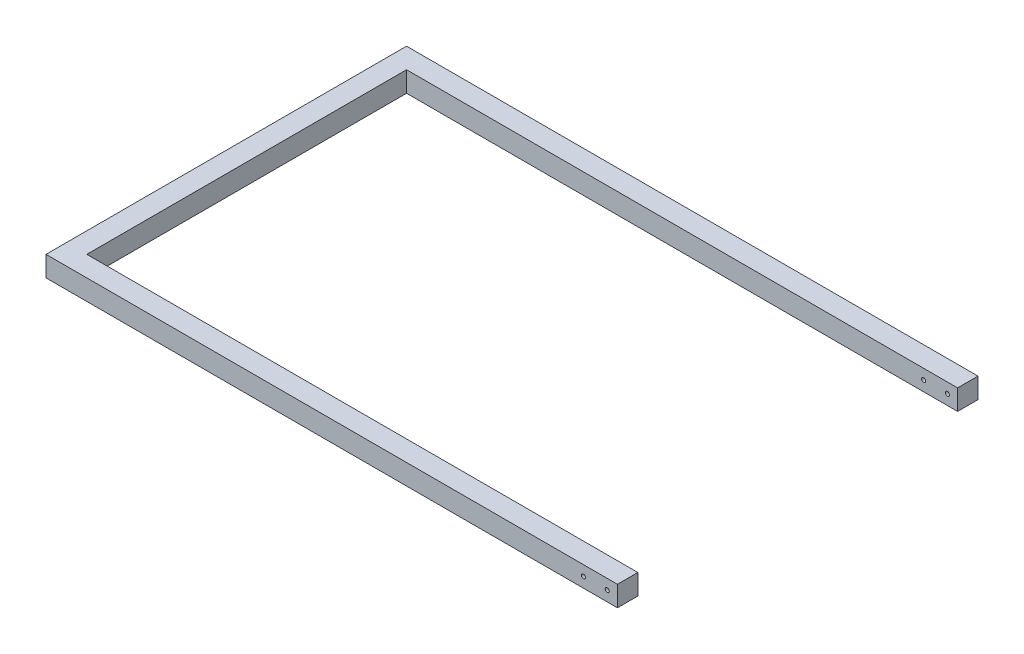
ISO-10303-21;
HEADER;
FILE_DESCRIPTION(('STEP AP214'),'2;1');
FILE_NAME('part.step','',(''),(''),'','','');
FILE_SCHEMA(('AUTOMOTIVE_DESIGN { 1 0 10303 214 1 1 1 1 }'));
ENDSEC;
DATA;
#1=APPLICATION_CONTEXT('core data for automotive mechanical design processes');
#2=APPLICATION_PROTOCOL_DEFINITION('international standard','automotive_design',2000,#1);
#3=PRODUCT_CONTEXT('',#1,'mechanical');
#4=PRODUCT('Part','Part','',(#3));
#5=PRODUCT_RELATED_PRODUCT_CATEGORY('part','',(#4));
#6=PRODUCT_DEFINITION_FORMATION('','',#4);
#7=PRODUCT_DEFINITION_CONTEXT('part definition',#1,'design');
#8=PRODUCT_DEFINITION('design','',#6,#7);
#9=PRODUCT_DEFINITION_SHAPE('','',#8);
#10=(LENGTH_UNIT() NAMED_UNIT(*) SI_UNIT(.MILLI.,.METRE.));
#11=(NAMED_UNIT(*) PLANE_ANGLE_UNIT() SI_UNIT($,.RADIAN.));
#12=(NAMED_UNIT(*) SI_UNIT($,.STERADIAN.) SOLID_ANGLE_UNIT());
#13=UNCERTAINTY_MEASURE_WITH_UNIT(LENGTH_MEASURE(1.E-05),#10,'distance_accuracy_value','');
#14=(GEOMETRIC_REPRESENTATION_CONTEXT(3) GLOBAL_UNCERTAINTY_ASSIGNED_CONTEXT((#13)) GLOBAL_UNIT_ASSIGNED_CONTEXT((#10,
#11,#12)) REPRESENTATION_CONTEXT('',''));
#15=CARTESIAN_POINT('',(0.,0.,0.));
#16=DIRECTION('',(0.,0.,1.));
#17=DIRECTION('',(1.,0.,0.));
#18=AXIS2_PLACEMENT_3D('',#15,#16,#17);
#19=CARTESIAN_POINT('',(-959.999999999999,30.,-235.));
#20=DIRECTION('',(0.,0.,1.));
#21=DIRECTION('',(1.,0.,0.));
#22=AXIS2_PLACEMENT_3D('',#19,#20,#21);
#23=PLANE('',#22);
#24=CARTESIAN_POINT('',(-165.,15.,-235.));
#25=DIRECTION('',(0.,0.,1.));
#26=DIRECTION('',(1.,0.,0.));
#27=AXIS2_PLACEMENT_3D('',#24,#25,#26);
#28=CIRCLE('',#27,2.99999999999999);
#29=CARTESIAN_POINT('',(-162.,15.,-235.));
#30=VERTEX_POINT('',#29);
#31=EDGE_CURVE('E189',#30,#30,#28,.T.);
#32=ORIENTED_EDGE('',*,*,#31,.F.);
#33=EDGE_LOOP('',(#32));
#34=FACE_BOUND('',#33,.T.);
#35=CARTESIAN_POINT('',(-200.,15.,-235.));
#36=DIRECTION('',(0.,0.,1.));
#37=DIRECTION('',(1.,0.,0.));
#38=AXIS2_PLACEMENT_3D('',#35,#36,#37);
#39=CIRCLE('',#38,2.99999999999999);
#40=CARTESIAN_POINT('',(-197.,15.,-235.));
#41=VERTEX_POINT('',#40);
#42=EDGE_CURVE('E109',#41,#41,#39,.T.);
#43=ORIENTED_EDGE('',*,*,#42,.F.);
#44=EDGE_LOOP('',(#43));
#45=FACE_BOUND('',#44,.T.);
#46=DIRECTION('',(0.,-1.,0.));
#47=VECTOR('',#46,1.);
#48=CARTESIAN_POINT('',(-150.,30.,-235.));
#49=LINE('',#48,#47);
#50=CARTESIAN_POINT('',(-150.,30.,-235.));
#51=VERTEX_POINT('',#50);
#52=CARTESIAN_POINT('',(-150.,0.,-235.));
#53=VERTEX_POINT('',#52);
#54=EDGE_CURVE('E46',#51,#53,#49,.T.);
#55=ORIENTED_EDGE('',*,*,#54,.F.);
#56=DIRECTION('',(-1.,0.,0.));
#57=VECTOR('',#56,1.);
#58=CARTESIAN_POINT('',(-959.999999999999,30.,-235.));
#59=LINE('',#58,#57);
#60=CARTESIAN_POINT('',(-959.999999999999,30.,-235.));
#61=VERTEX_POINT('',#60);
#62=EDGE_CURVE('E102',#51,#61,#59,.T.);
#63=ORIENTED_EDGE('',*,*,#62,.T.);
#64=DIRECTION('',(0.,-1.,0.));
#65=VECTOR('',#64,1.);
#66=CARTESIAN_POINT('',(-959.999999999999,30.,-235.));
#67=LINE('',#66,#65);
#68=CARTESIAN_POINT('',(-959.999999999999,0.,-235.));
#69=VERTEX_POINT('',#68);
#70=EDGE_CURVE('E105',#61,#69,#67,.T.);
#71=ORIENTED_EDGE('',*,*,#70,.T.);
#72=DIRECTION('',(-1.,0.,0.));
#73=VECTOR('',#72,1.);
#74=CARTESIAN_POINT('',(-959.999999999999,0.,-235.));
#75=LINE('',#74,#73);
#76=EDGE_CURVE('E138',#53,#69,#75,.T.);
#77=ORIENTED_EDGE('',*,*,#76,.F.);
#78=EDGE_LOOP('',(#55,#63,#71,#77));
#79=FACE_BOUND('',#78,.T.);
#80=ADVANCED_FACE('F37',(#34,#45,#79),#23,.T.);
#81=CARTESIAN_POINT('',(-959.999999999999,30.,235.));
#82=DIRECTION('',(0.,0.,-1.));
#83=DIRECTION('',(-1.,0.,0.));
#84=AXIS2_PLACEMENT_3D('',#81,#82,#83);
#85=PLANE('',#84);
#86=CARTESIAN_POINT('',(-165.,15.,235.));
#87=DIRECTION('',(0.,0.,-1.));
#88=DIRECTION('',(-1.,0.,0.));
#89=AXIS2_PLACEMENT_3D('',#86,#87,#88);
#90=CIRCLE('',#89,2.99999999999999);
#91=CARTESIAN_POINT('',(-168.,15.,235.));
#92=VERTEX_POINT('',#91);
#93=EDGE_CURVE('E192',#92,#92,#90,.T.);
#94=ORIENTED_EDGE('',*,*,#93,.F.);
#95=EDGE_LOOP('',(#94));
#96=FACE_BOUND('',#95,.T.);
#97=CARTESIAN_POINT('',(-200.,15.,235.));
#98=DIRECTION('',(0.,0.,-1.));
#99=DIRECTION('',(-1.,0.,0.));
#100=AXIS2_PLACEMENT_3D('',#97,#98,#99);
#101=CIRCLE('',#100,2.99999999999999);
#102=CARTESIAN_POINT('',(-203.,15.,235.));
#103=VERTEX_POINT('',#102);
#104=EDGE_CURVE('E183',#103,#103,#101,.T.);
#105=ORIENTED_EDGE('',*,*,#104,.F.);
#106=EDGE_LOOP('',(#105));
#107=FACE_BOUND('',#106,.T.);
#108=DIRECTION('',(0.,1.,0.));
#109=VECTOR('',#108,1.);
#110=CARTESIAN_POINT('',(-150.,30.,235.));
#111=LINE('',#110,#109);
#112=CARTESIAN_POINT('',(-150.,0.,235.));
#113=VERTEX_POINT('',#112);
#114=CARTESIAN_POINT('',(-150.,30.,235.));
#115=VERTEX_POINT('',#114);
#116=EDGE_CURVE('E125',#113,#115,#111,.T.);
#117=ORIENTED_EDGE('',*,*,#116,.F.);
#118=DIRECTION('',(1.,0.,0.));
#119=VECTOR('',#118,1.);
#120=CARTESIAN_POINT('',(-959.999999999999,0.,235.));
#121=LINE('',#120,#119);
#122=CARTESIAN_POINT('',(-959.999999999999,0.,235.));
#123=VERTEX_POINT('',#122);
#124=EDGE_CURVE('E158',#123,#113,#121,.T.);
#125=ORIENTED_EDGE('',*,*,#124,.F.);
#126=DIRECTION('',(0.,-1.,0.));
#127=VECTOR('',#126,1.);
#128=CARTESIAN_POINT('',(-959.999999999999,30.,235.));
#129=LINE('',#128,#127);
#130=CARTESIAN_POINT('',(-959.999999999999,30.,235.));
#131=VERTEX_POINT('',#130);
#132=EDGE_CURVE('E122',#131,#123,#129,.T.);
#133=ORIENTED_EDGE('',*,*,#132,.F.);
#134=DIRECTION('',(1.,0.,0.));
#135=VECTOR('',#134,1.);
#136=CARTESIAN_POINT('',(-959.999999999999,30.,235.));
#137=LINE('',#136,#135);
#138=EDGE_CURVE('E118',#131,#115,#137,.T.);
#139=ORIENTED_EDGE('',*,*,#138,.T.);
#140=EDGE_LOOP('',(#117,#125,#133,#139));
#141=FACE_BOUND('',#140,.T.);
#142=ADVANCED_FACE('F216',(#96,#107,#141),#85,.T.);
#143=CARTESIAN_POINT('',(0.,0.,0.));
#144=DIRECTION('',(0.,1.,0.));
#145=DIRECTION('',(0.,0.,1.));
#146=AXIS2_PLACEMENT_3D('',#143,#144,#145);
#147=PLANE('',#146);
#148=DIRECTION('',(-1.,0.,0.));
#149=VECTOR('',#148,1.);
#150=CARTESIAN_POINT('',(-990.,0.,-265.));
#151=LINE('',#150,#149);
#152=CARTESIAN_POINT('',(-150.,0.,-265.));
#153=VERTEX_POINT('',#152);
#154=CARTESIAN_POINT('',(-990.,0.,-265.));
#155=VERTEX_POINT('',#154);
#156=EDGE_CURVE('E142',#153,#155,#151,.T.);
#157=ORIENTED_EDGE('',*,*,#156,.F.);
#158=DIRECTION('',(0.,0.,1.));
#159=VECTOR('',#158,1.);
#160=CARTESIAN_POINT('',(-150.,0.,-265.));
#161=LINE('',#160,#159);
#162=EDGE_CURVE('E135',#153,#53,#161,.T.);
#163=ORIENTED_EDGE('',*,*,#162,.T.);
#164=ORIENTED_EDGE('',*,*,#76,.T.);
#165=DIRECTION('',(0.,0.,1.));
#166=VECTOR('',#165,1.);
#167=CARTESIAN_POINT('',(-959.999999999999,0.,-235.));
#168=LINE('',#167,#166);
#169=EDGE_CURVE('E117',#69,#123,#168,.T.);
#170=ORIENTED_EDGE('',*,*,#169,.T.);
#171=ORIENTED_EDGE('',*,*,#124,.T.);
#172=CARTESIAN_POINT('',(-150.,0.,265.));
#173=VERTEX_POINT('',#172);
#174=EDGE_CURVE('E139',#113,#173,#161,.T.);
#175=ORIENTED_EDGE('',*,*,#174,.T.);
#176=DIRECTION('',(1.,0.,0.));
#177=VECTOR('',#176,1.);
#178=CARTESIAN_POINT('',(-989.999999999999,0.,265.));
#179=LINE('',#178,#177);
#180=CARTESIAN_POINT('',(-989.999999999999,0.,265.));
#181=VERTEX_POINT('',#180);
#182=EDGE_CURVE('E128',#181,#173,#179,.T.);
#183=ORIENTED_EDGE('',*,*,#182,.F.);
#184=DIRECTION('',(0.,0.,1.));
#185=VECTOR('',#184,1.);
#186=CARTESIAN_POINT('',(-990.,0.,-265.));
#187=LINE('',#186,#185);
#188=EDGE_CURVE('E147',#155,#181,#187,.T.);
#189=ORIENTED_EDGE('',*,*,#188,.F.);
#190=EDGE_LOOP('',(#157,#163,#164,#170,#171,#175,#183,#189));
#191=FACE_BOUND('',#190,.T.);
#192=ADVANCED_FACE('F162',(#191),#147,.F.);
#193=CARTESIAN_POINT('',(0.,30.,0.));
#194=DIRECTION('',(0.,1.,0.));
#195=DIRECTION('',(0.,0.,1.));
#196=AXIS2_PLACEMENT_3D('',#193,#194,#195);
#197=PLANE('',#196);
#198=DIRECTION('',(0.,0.,1.));
#199=VECTOR('',#198,1.);
#200=CARTESIAN_POINT('',(-150.,30.,-265.));
#201=LINE('',#200,#199);
#202=CARTESIAN_POINT('',(-150.,30.,-265.));
#203=VERTEX_POINT('',#202);
#204=EDGE_CURVE('E11',#203,#51,#201,.T.);
#205=ORIENTED_EDGE('',*,*,#204,.F.);
#206=DIRECTION('',(-1.,0.,0.));
#207=VECTOR('',#206,1.);
#208=CARTESIAN_POINT('',(-990.,30.,-265.));
#209=LINE('',#208,#207);
#210=CARTESIAN_POINT('',(-990.,30.,-265.));
#211=VERTEX_POINT('',#210);
#212=EDGE_CURVE('E153',#203,#211,#209,.T.);
#213=ORIENTED_EDGE('',*,*,#212,.T.);
#214=DIRECTION('',(0.,0.,1.));
#215=VECTOR('',#214,1.);
#216=CARTESIAN_POINT('',(-990.,30.,-265.));
#217=LINE('',#216,#215);
#218=CARTESIAN_POINT('',(-989.999999999999,30.,265.));
#219=VERTEX_POINT('',#218);
#220=EDGE_CURVE('E150',#211,#219,#217,.T.);
#221=ORIENTED_EDGE('',*,*,#220,.T.);
#222=DIRECTION('',(1.,0.,0.));
#223=VECTOR('',#222,1.);
#224=CARTESIAN_POINT('',(-989.999999999999,30.,265.));
#225=LINE('',#224,#223);
#226=CARTESIAN_POINT('',(-150.,30.,265.));
#227=VERTEX_POINT('',#226);
#228=EDGE_CURVE('E143',#219,#227,#225,.T.);
#229=ORIENTED_EDGE('',*,*,#228,.T.);
#230=EDGE_CURVE('E48',#115,#227,#201,.T.);
#231=ORIENTED_EDGE('',*,*,#230,.F.);
#232=ORIENTED_EDGE('',*,*,#138,.F.);
#233=DIRECTION('',(0.,0.,1.));
#234=VECTOR('',#233,1.);
#235=CARTESIAN_POINT('',(-959.999999999999,30.,-235.));
#236=LINE('',#235,#234);
#237=EDGE_CURVE('E114',#61,#131,#236,.T.);
#238=ORIENTED_EDGE('',*,*,#237,.F.);
#239=ORIENTED_EDGE('',*,*,#62,.F.);
#240=EDGE_LOOP('',(#205,#213,#221,#229,#231,#232,#238,#239));
#241=FACE_BOUND('',#240,.T.);
#242=ADVANCED_FACE('F120',(#241),#197,.T.);
#243=CARTESIAN_POINT('',(-990.,30.,-265.));
#244=DIRECTION('',(0.,0.,1.));
#245=DIRECTION('',(1.,0.,0.));
#246=AXIS2_PLACEMENT_3D('',#243,#244,#245);
#247=PLANE('',#246);
#248=CARTESIAN_POINT('',(-165.,15.,-265.));
#249=DIRECTION('',(0.,0.,1.));
#250=DIRECTION('',(1.,0.,0.));
#251=AXIS2_PLACEMENT_3D('',#248,#249,#250);
#252=CIRCLE('',#251,2.99999999999999);
#253=CARTESIAN_POINT('',(-162.,15.,-265.));
#254=VERTEX_POINT('',#253);
#255=EDGE_CURVE('E195',#254,#254,#252,.T.);
#256=ORIENTED_EDGE('',*,*,#255,.T.);
#257=EDGE_LOOP('',(#256));
#258=FACE_BOUND('',#257,.T.);
#259=CARTESIAN_POINT('',(-200.,15.,-265.));
#260=DIRECTION('',(0.,0.,1.));
#261=DIRECTION('',(1.,0.,0.));
#262=AXIS2_PLACEMENT_3D('',#259,#260,#261);
#263=CIRCLE('',#262,2.99999999999999);
#264=CARTESIAN_POINT('',(-197.,15.,-265.));
#265=VERTEX_POINT('',#264);
#266=EDGE_CURVE('E186',#265,#265,#263,.T.);
#267=ORIENTED_EDGE('',*,*,#266,.T.);
#268=EDGE_LOOP('',(#267));
#269=FACE_BOUND('',#268,.T.);
#270=ORIENTED_EDGE('',*,*,#212,.F.);
#271=DIRECTION('',(0.,-1.,0.));
#272=VECTOR('',#271,1.);
#273=CARTESIAN_POINT('',(-150.,30.,-265.));
#274=LINE('',#273,#272);
#275=EDGE_CURVE('E140',#203,#153,#274,.T.);
#276=ORIENTED_EDGE('',*,*,#275,.T.);
#277=ORIENTED_EDGE('',*,*,#156,.T.);
#278=DIRECTION('',(0.,-1.,0.));
#279=VECTOR('',#278,1.);
#280=CARTESIAN_POINT('',(-990.,30.,-265.));
#281=LINE('',#280,#279);
#282=EDGE_CURVE('E169',#211,#155,#281,.T.);
#283=ORIENTED_EDGE('',*,*,#282,.F.);
#284=EDGE_LOOP('',(#270,#276,#277,#283));
#285=FACE_BOUND('',#284,.T.);
#286=ADVANCED_FACE('F167',(#258,#269,#285),#247,.F.);
#287=CARTESIAN_POINT('',(-990.,30.,-265.));
#288=DIRECTION('',(1.,0.,0.));
#289=DIRECTION('',(0.,0.,-1.));
#290=AXIS2_PLACEMENT_3D('',#287,#288,#289);
#291=PLANE('',#290);
#292=ORIENTED_EDGE('',*,*,#188,.T.);
#293=DIRECTION('',(0.,-1.,0.));
#294=VECTOR('',#293,1.);
#295=CARTESIAN_POINT('',(-989.999999999999,30.,265.));
#296=LINE('',#295,#294);
#297=EDGE_CURVE('E123',#219,#181,#296,.T.);
#298=ORIENTED_EDGE('',*,*,#297,.F.);
#299=ORIENTED_EDGE('',*,*,#220,.F.);
#300=ORIENTED_EDGE('',*,*,#282,.T.);
#301=EDGE_LOOP('',(#292,#298,#299,#300));
#302=FACE_BOUND('',#301,.T.);
#303=ADVANCED_FACE('F174',(#302),#291,.F.);
#304=CARTESIAN_POINT('',(-989.999999999999,30.,265.));
#305=DIRECTION('',(0.,0.,-1.));
#306=DIRECTION('',(-1.,0.,0.));
#307=AXIS2_PLACEMENT_3D('',#304,#305,#306);
#308=PLANE('',#307);
#309=CARTESIAN_POINT('',(-165.,15.,265.));
#310=DIRECTION('',(0.,0.,1.));
#311=DIRECTION('',(1.,0.,0.));
#312=AXIS2_PLACEMENT_3D('',#309,#310,#311);
#313=CIRCLE('',#312,2.99999999999999);
#314=CARTESIAN_POINT('',(-162.,15.,265.));
#315=VERTEX_POINT('',#314);
#316=EDGE_CURVE('E196',#315,#315,#313,.T.);
#317=ORIENTED_EDGE('',*,*,#316,.F.);
#318=EDGE_LOOP('',(#317));
#319=FACE_BOUND('',#318,.T.);
#320=CARTESIAN_POINT('',(-200.,15.,265.));
#321=DIRECTION('',(0.,0.,-1.));
#322=DIRECTION('',(-1.,0.,0.));
#323=AXIS2_PLACEMENT_3D('',#320,#321,#322);
#324=CIRCLE('',#323,2.99999999999999);
#325=CARTESIAN_POINT('',(-203.,15.,265.));
#326=VERTEX_POINT('',#325);
#327=EDGE_CURVE('E40',#326,#326,#324,.T.);
#328=ORIENTED_EDGE('',*,*,#327,.T.);
#329=EDGE_LOOP('',(#328));
#330=FACE_BOUND('',#329,.T.);
#331=ORIENTED_EDGE('',*,*,#182,.T.);
#332=DIRECTION('',(0.,-1.,0.));
#333=VECTOR('',#332,1.);
#334=CARTESIAN_POINT('',(-150.,30.,265.));
#335=LINE('',#334,#333);
#336=EDGE_CURVE('E70',#227,#173,#335,.T.);
#337=ORIENTED_EDGE('',*,*,#336,.F.);
#338=ORIENTED_EDGE('',*,*,#228,.F.);
#339=ORIENTED_EDGE('',*,*,#297,.T.);
#340=EDGE_LOOP('',(#331,#337,#338,#339));
#341=FACE_BOUND('',#340,.T.);
#342=ADVANCED_FACE('F178',(#319,#330,#341),#308,.F.);
#343=CARTESIAN_POINT('',(-959.999999999999,30.,-235.));
#344=DIRECTION('',(1.,0.,0.));
#345=DIRECTION('',(0.,0.,-1.));
#346=AXIS2_PLACEMENT_3D('',#343,#344,#345);
#347=PLANE('',#346);
#348=ORIENTED_EDGE('',*,*,#169,.F.);
#349=ORIENTED_EDGE('',*,*,#70,.F.);
#350=ORIENTED_EDGE('',*,*,#237,.T.);
#351=ORIENTED_EDGE('',*,*,#132,.T.);
#352=EDGE_LOOP('',(#348,#349,#350,#351));
#353=FACE_BOUND('',#352,.T.);
#354=ADVANCED_FACE('F113',(#353),#347,.T.);
#355=CARTESIAN_POINT('',(-150.,30.,-265.));
#356=DIRECTION('',(-1.,0.,0.));
#357=DIRECTION('',(0.,0.,1.));
#358=AXIS2_PLACEMENT_3D('',#355,#356,#357);
#359=PLANE('',#358);
#360=ORIENTED_EDGE('',*,*,#116,.T.);
#361=ORIENTED_EDGE('',*,*,#230,.T.);
#362=ORIENTED_EDGE('',*,*,#336,.T.);
#363=ORIENTED_EDGE('',*,*,#174,.F.);
#364=EDGE_LOOP('',(#360,#361,#362,#363));
#365=FACE_BOUND('',#364,.T.);
#366=ADVANCED_FACE('F243',(#365),#359,.F.);
#367=ORIENTED_EDGE('',*,*,#54,.T.);
#368=ORIENTED_EDGE('',*,*,#162,.F.);
#369=ORIENTED_EDGE('',*,*,#275,.F.);
#370=ORIENTED_EDGE('',*,*,#204,.T.);
#371=EDGE_LOOP('',(#367,#368,#369,#370));
#372=FACE_BOUND('',#371,.T.);
#373=ADVANCED_FACE('F165',(#372),#359,.F.);
#374=CARTESIAN_POINT('',(-200.,15.,-265.));
#375=DIRECTION('',(0.,0.,1.));
#376=DIRECTION('',(1.,0.,0.));
#377=AXIS2_PLACEMENT_3D('',#374,#375,#376);
#378=CYLINDRICAL_SURFACE('',#377,2.99999999999999);
#379=ORIENTED_EDGE('',*,*,#104,.T.);
#380=EDGE_LOOP('',(#379));
#381=FACE_BOUND('',#380,.T.);
#382=ORIENTED_EDGE('',*,*,#327,.F.);
#383=EDGE_LOOP('',(#382));
#384=FACE_BOUND('',#383,.T.);
#385=ADVANCED_FACE('F230',(#381,#384),#378,.F.);
#386=ORIENTED_EDGE('',*,*,#42,.T.);
#387=EDGE_LOOP('',(#386));
#388=FACE_BOUND('',#387,.T.);
#389=ORIENTED_EDGE('',*,*,#266,.F.);
#390=EDGE_LOOP('',(#389));
#391=FACE_BOUND('',#390,.T.);
#392=ADVANCED_FACE('F212',(#388,#391),#378,.F.);
#393=CARTESIAN_POINT('',(-165.,15.,-265.));
#394=DIRECTION('',(0.,0.,1.));
#395=DIRECTION('',(1.,0.,0.));
#396=AXIS2_PLACEMENT_3D('',#393,#394,#395);
#397=CYLINDRICAL_SURFACE('',#396,2.99999999999999);
#398=ORIENTED_EDGE('',*,*,#93,.T.);
#399=EDGE_LOOP('',(#398));
#400=FACE_BOUND('',#399,.T.);
#401=ORIENTED_EDGE('',*,*,#316,.T.);
#402=EDGE_LOOP('',(#401));
#403=FACE_BOUND('',#402,.T.);
#404=ADVANCED_FACE('F206',(#400,#403),#397,.F.);
#405=ORIENTED_EDGE('',*,*,#31,.T.);
#406=EDGE_LOOP('',(#405));
#407=FACE_BOUND('',#406,.T.);
#408=ORIENTED_EDGE('',*,*,#255,.F.);
#409=EDGE_LOOP('',(#408));
#410=FACE_BOUND('',#409,.T.);
#411=ADVANCED_FACE('F204',(#407,#410),#397,.F.);
#412=CLOSED_SHELL('',(#80,#142,#192,#242,#286,#303,#342,#354,#366,#373,#385,#392,#404,#411));
#413=MANIFOLD_SOLID_BREP('B2',#412);
#414=ADVANCED_BREP_SHAPE_REPRESENTATION('',(#18,#413),#14);
#415=SHAPE_DEFINITION_REPRESENTATION(#9,#414);
ENDSEC;
END-ISO-10303-21;
